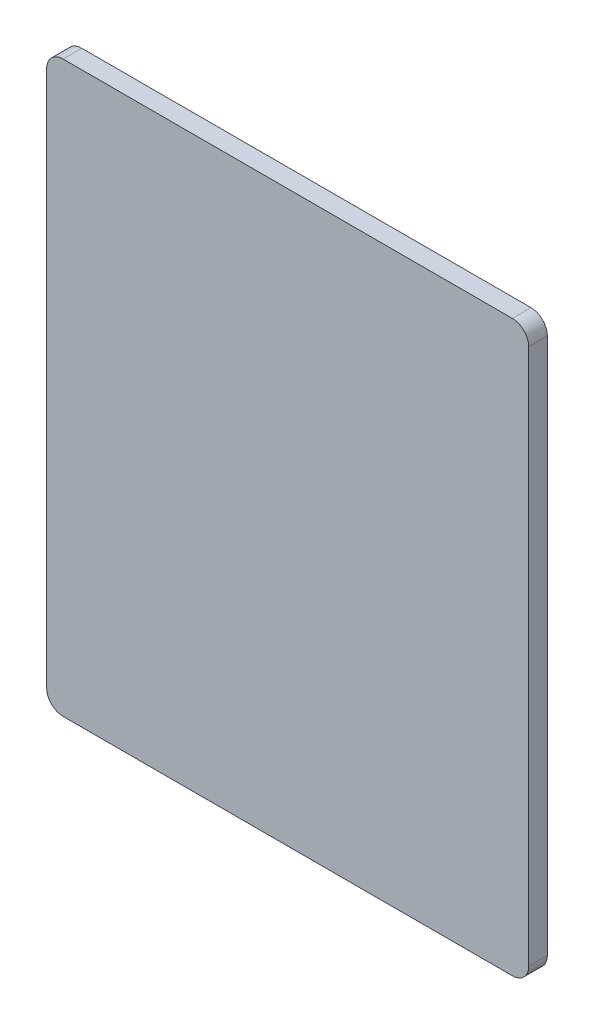
ISO-10303-21;
HEADER;
FILE_DESCRIPTION(('STEP AP214'),'2;1');
FILE_NAME('part.step','',(''),(''),'','','');
FILE_SCHEMA(('AUTOMOTIVE_DESIGN { 1 0 10303 214 1 1 1 1 }'));
ENDSEC;
DATA;
#1=APPLICATION_CONTEXT('core data for automotive mechanical design processes');
#2=APPLICATION_PROTOCOL_DEFINITION('international standard','automotive_design',2000,#1);
#3=PRODUCT_CONTEXT('',#1,'mechanical');
#4=PRODUCT('Part','Part','',(#3));
#5=PRODUCT_RELATED_PRODUCT_CATEGORY('part','',(#4));
#6=PRODUCT_DEFINITION_FORMATION('','',#4);
#7=PRODUCT_DEFINITION_CONTEXT('part definition',#1,'design');
#8=PRODUCT_DEFINITION('design','',#6,#7);
#9=PRODUCT_DEFINITION_SHAPE('','',#8);
#10=(LENGTH_UNIT() NAMED_UNIT(*) SI_UNIT(.MILLI.,.METRE.));
#11=(NAMED_UNIT(*) PLANE_ANGLE_UNIT() SI_UNIT($,.RADIAN.));
#12=(NAMED_UNIT(*) SI_UNIT($,.STERADIAN.) SOLID_ANGLE_UNIT());
#13=UNCERTAINTY_MEASURE_WITH_UNIT(LENGTH_MEASURE(1.E-05),#10,'distance_accuracy_value','');
#14=(GEOMETRIC_REPRESENTATION_CONTEXT(3) GLOBAL_UNCERTAINTY_ASSIGNED_CONTEXT((#13)) GLOBAL_UNIT_ASSIGNED_CONTEXT((#10,
#11,#12)) REPRESENTATION_CONTEXT('',''));
#15=CARTESIAN_POINT('',(0.,0.,0.));
#16=DIRECTION('',(0.,0.,1.));
#17=DIRECTION('',(1.,0.,0.));
#18=AXIS2_PLACEMENT_3D('',#15,#16,#17);
#19=CARTESIAN_POINT('',(265.,-313.,10.25));
#20=DIRECTION('',(-1.,0.,0.));
#21=DIRECTION('',(0.,0.,1.));
#22=AXIS2_PLACEMENT_3D('',#19,#20,#21);
#23=PLANE('',#22);
#24=DIRECTION('',(0.,1.,0.));
#25=VECTOR('',#24,1.);
#26=CARTESIAN_POINT('',(265.,-313.,10.25));
#27=LINE('',#26,#25);
#28=CARTESIAN_POINT('',(265.,-295.,10.25));
#29=VERTEX_POINT('',#28);
#30=CARTESIAN_POINT('',(265.,295.,10.25));
#31=VERTEX_POINT('',#30);
#32=EDGE_CURVE('E127',#29,#31,#27,.T.);
#33=ORIENTED_EDGE('',*,*,#32,.F.);
#34=DIRECTION('',(0.,0.,-1.));
#35=VECTOR('',#34,1.);
#36=CARTESIAN_POINT('',(265.,-295.,10.25));
#37=LINE('',#36,#35);
#38=CARTESIAN_POINT('',(265.,-295.,-10.25));
#39=VERTEX_POINT('',#38);
#40=EDGE_CURVE('E153',#29,#39,#37,.T.);
#41=ORIENTED_EDGE('',*,*,#40,.T.);
#42=DIRECTION('',(0.,1.,0.));
#43=VECTOR('',#42,1.);
#44=CARTESIAN_POINT('',(265.,-313.,-10.25));
#45=LINE('',#44,#43);
#46=CARTESIAN_POINT('',(265.,295.,-10.25));
#47=VERTEX_POINT('',#46);
#48=EDGE_CURVE('E159',#39,#47,#45,.T.);
#49=ORIENTED_EDGE('',*,*,#48,.T.);
#50=DIRECTION('',(0.,0.,-1.));
#51=VECTOR('',#50,1.);
#52=CARTESIAN_POINT('',(265.,295.,10.25));
#53=LINE('',#52,#51);
#54=EDGE_CURVE('E151',#47,#31,#53,.F.);
#55=ORIENTED_EDGE('',*,*,#54,.T.);
#56=EDGE_LOOP('',(#33,#41,#49,#55));
#57=FACE_BOUND('',#56,.T.);
#58=ADVANCED_FACE('F35',(#57),#23,.F.);
#59=CARTESIAN_POINT('',(-265.,313.,10.25));
#60=DIRECTION('',(0.,-1.,0.));
#61=DIRECTION('',(0.,0.,-1.));
#62=AXIS2_PLACEMENT_3D('',#59,#60,#61);
#63=PLANE('',#62);
#64=DIRECTION('',(-1.,0.,0.));
#65=VECTOR('',#64,1.);
#66=CARTESIAN_POINT('',(-265.,313.,10.25));
#67=LINE('',#66,#65);
#68=CARTESIAN_POINT('',(247.,313.,10.25));
#69=VERTEX_POINT('',#68);
#70=CARTESIAN_POINT('',(-247.,313.,10.25));
#71=VERTEX_POINT('',#70);
#72=EDGE_CURVE('E130',#69,#71,#67,.T.);
#73=ORIENTED_EDGE('',*,*,#72,.F.);
#74=DIRECTION('',(0.,0.,-1.));
#75=VECTOR('',#74,1.);
#76=CARTESIAN_POINT('',(247.,313.,10.25));
#77=LINE('',#76,#75);
#78=CARTESIAN_POINT('',(247.,313.,-10.25));
#79=VERTEX_POINT('',#78);
#80=EDGE_CURVE('E11',#69,#79,#77,.T.);
#81=ORIENTED_EDGE('',*,*,#80,.T.);
#82=DIRECTION('',(-1.,0.,0.));
#83=VECTOR('',#82,1.);
#84=CARTESIAN_POINT('',(-265.,313.,-10.25));
#85=LINE('',#84,#83);
#86=CARTESIAN_POINT('',(-247.,313.,-10.25));
#87=VERTEX_POINT('',#86);
#88=EDGE_CURVE('E132',#79,#87,#85,.T.);
#89=ORIENTED_EDGE('',*,*,#88,.T.);
#90=DIRECTION('',(0.,0.,-1.));
#91=VECTOR('',#90,1.);
#92=CARTESIAN_POINT('',(-247.,313.,10.25));
#93=LINE('',#92,#91);
#94=EDGE_CURVE('E43',#87,#71,#93,.F.);
#95=ORIENTED_EDGE('',*,*,#94,.T.);
#96=EDGE_LOOP('',(#73,#81,#89,#95));
#97=FACE_BOUND('',#96,.T.);
#98=ADVANCED_FACE('F178',(#97),#63,.F.);
#99=CARTESIAN_POINT('',(-265.,-313.,10.25));
#100=DIRECTION('',(1.,0.,0.));
#101=DIRECTION('',(0.,0.,-1.));
#102=AXIS2_PLACEMENT_3D('',#99,#100,#101);
#103=PLANE('',#102);
#104=DIRECTION('',(0.,-1.,0.));
#105=VECTOR('',#104,1.);
#106=CARTESIAN_POINT('',(-265.,-313.,-10.25));
#107=LINE('',#106,#105);
#108=CARTESIAN_POINT('',(-265.,295.,-10.25));
#109=VERTEX_POINT('',#108);
#110=CARTESIAN_POINT('',(-265.,-295.,-10.25));
#111=VERTEX_POINT('',#110);
#112=EDGE_CURVE('E128',#109,#111,#107,.T.);
#113=ORIENTED_EDGE('',*,*,#112,.T.);
#114=DIRECTION('',(0.,0.,-1.));
#115=VECTOR('',#114,1.);
#116=CARTESIAN_POINT('',(-265.,-295.,10.25));
#117=LINE('',#116,#115);
#118=CARTESIAN_POINT('',(-265.,-295.,10.25));
#119=VERTEX_POINT('',#118);
#120=EDGE_CURVE('E106',#111,#119,#117,.F.);
#121=ORIENTED_EDGE('',*,*,#120,.T.);
#122=DIRECTION('',(0.,-1.,0.));
#123=VECTOR('',#122,1.);
#124=CARTESIAN_POINT('',(-265.,-313.,10.25));
#125=LINE('',#124,#123);
#126=CARTESIAN_POINT('',(-265.,295.,10.25));
#127=VERTEX_POINT('',#126);
#128=EDGE_CURVE('E167',#127,#119,#125,.T.);
#129=ORIENTED_EDGE('',*,*,#128,.F.);
#130=DIRECTION('',(0.,0.,-1.));
#131=VECTOR('',#130,1.);
#132=CARTESIAN_POINT('',(-265.,295.,10.25));
#133=LINE('',#132,#131);
#134=EDGE_CURVE('E111',#127,#109,#133,.T.);
#135=ORIENTED_EDGE('',*,*,#134,.T.);
#136=EDGE_LOOP('',(#113,#121,#129,#135));
#137=FACE_BOUND('',#136,.T.);
#138=ADVANCED_FACE('F177',(#137),#103,.F.);
#139=CARTESIAN_POINT('',(-265.,-313.,10.25));
#140=DIRECTION('',(0.,1.,0.));
#141=DIRECTION('',(0.,0.,1.));
#142=AXIS2_PLACEMENT_3D('',#139,#140,#141);
#143=PLANE('',#142);
#144=DIRECTION('',(1.,0.,0.));
#145=VECTOR('',#144,1.);
#146=CARTESIAN_POINT('',(-265.,-313.,10.25));
#147=LINE('',#146,#145);
#148=CARTESIAN_POINT('',(-247.,-313.,10.25));
#149=VERTEX_POINT('',#148);
#150=CARTESIAN_POINT('',(247.,-313.,10.25));
#151=VERTEX_POINT('',#150);
#152=EDGE_CURVE('E121',#149,#151,#147,.T.);
#153=ORIENTED_EDGE('',*,*,#152,.F.);
#154=DIRECTION('',(0.,0.,-1.));
#155=VECTOR('',#154,1.);
#156=CARTESIAN_POINT('',(-247.,-313.,10.25));
#157=LINE('',#156,#155);
#158=CARTESIAN_POINT('',(-247.,-313.,-10.25));
#159=VERTEX_POINT('',#158);
#160=EDGE_CURVE('E105',#149,#159,#157,.T.);
#161=ORIENTED_EDGE('',*,*,#160,.T.);
#162=DIRECTION('',(1.,0.,0.));
#163=VECTOR('',#162,1.);
#164=CARTESIAN_POINT('',(-265.,-313.,-10.25));
#165=LINE('',#164,#163);
#166=CARTESIAN_POINT('',(247.,-313.,-10.25));
#167=VERTEX_POINT('',#166);
#168=EDGE_CURVE('E118',#159,#167,#165,.T.);
#169=ORIENTED_EDGE('',*,*,#168,.T.);
#170=DIRECTION('',(0.,0.,-1.));
#171=VECTOR('',#170,1.);
#172=CARTESIAN_POINT('',(247.,-313.,10.25));
#173=LINE('',#172,#171);
#174=EDGE_CURVE('E123',#167,#151,#173,.F.);
#175=ORIENTED_EDGE('',*,*,#174,.T.);
#176=EDGE_LOOP('',(#153,#161,#169,#175));
#177=FACE_BOUND('',#176,.T.);
#178=ADVANCED_FACE('F117',(#177),#143,.F.);
#179=CARTESIAN_POINT('',(0.,0.,10.25));
#180=DIRECTION('',(0.,0.,-1.));
#181=DIRECTION('',(-1.,0.,0.));
#182=AXIS2_PLACEMENT_3D('',#179,#180,#181);
#183=PLANE('',#182);
#184=ORIENTED_EDGE('',*,*,#128,.T.);
#185=CARTESIAN_POINT('',(-247.,-295.,10.25));
#186=DIRECTION('',(0.,0.,-1.));
#187=DIRECTION('',(-1.,0.,0.));
#188=AXIS2_PLACEMENT_3D('',#185,#186,#187);
#189=CIRCLE('',#188,18.);
#190=EDGE_CURVE('E149',#119,#149,#189,.F.);
#191=ORIENTED_EDGE('',*,*,#190,.T.);
#192=ORIENTED_EDGE('',*,*,#152,.T.);
#193=CARTESIAN_POINT('',(247.,-295.,10.25));
#194=DIRECTION('',(0.,0.,-1.));
#195=DIRECTION('',(-1.,0.,0.));
#196=AXIS2_PLACEMENT_3D('',#193,#194,#195);
#197=CIRCLE('',#196,18.);
#198=EDGE_CURVE('E147',#151,#29,#197,.F.);
#199=ORIENTED_EDGE('',*,*,#198,.T.);
#200=ORIENTED_EDGE('',*,*,#32,.T.);
#201=CARTESIAN_POINT('',(247.,295.,10.25));
#202=DIRECTION('',(0.,0.,-1.));
#203=DIRECTION('',(-1.,0.,0.));
#204=AXIS2_PLACEMENT_3D('',#201,#202,#203);
#205=CIRCLE('',#204,18.);
#206=EDGE_CURVE('E56',#31,#69,#205,.F.);
#207=ORIENTED_EDGE('',*,*,#206,.T.);
#208=ORIENTED_EDGE('',*,*,#72,.T.);
#209=CARTESIAN_POINT('',(-247.,295.,10.25));
#210=DIRECTION('',(0.,0.,-1.));
#211=DIRECTION('',(-1.,0.,0.));
#212=AXIS2_PLACEMENT_3D('',#209,#210,#211);
#213=CIRCLE('',#212,18.);
#214=EDGE_CURVE('E144',#71,#127,#213,.F.);
#215=ORIENTED_EDGE('',*,*,#214,.T.);
#216=EDGE_LOOP('',(#184,#191,#192,#199,#200,#207,#208,#215));
#217=FACE_BOUND('',#216,.T.);
#218=ADVANCED_FACE('F171',(#217),#183,.F.);
#219=CARTESIAN_POINT('',(0.,0.,-10.25));
#220=DIRECTION('',(0.,0.,-1.));
#221=DIRECTION('',(-1.,0.,0.));
#222=AXIS2_PLACEMENT_3D('',#219,#220,#221);
#223=PLANE('',#222);
#224=ORIENTED_EDGE('',*,*,#168,.F.);
#225=CARTESIAN_POINT('',(-247.,-295.,-10.25));
#226=DIRECTION('',(0.,0.,-1.));
#227=DIRECTION('',(-1.,0.,0.));
#228=AXIS2_PLACEMENT_3D('',#225,#226,#227);
#229=CIRCLE('',#228,18.);
#230=EDGE_CURVE('E101',#159,#111,#229,.T.);
#231=ORIENTED_EDGE('',*,*,#230,.T.);
#232=ORIENTED_EDGE('',*,*,#112,.F.);
#233=CARTESIAN_POINT('',(-247.,295.,-10.25));
#234=DIRECTION('',(0.,0.,-1.));
#235=DIRECTION('',(-1.,0.,0.));
#236=AXIS2_PLACEMENT_3D('',#233,#234,#235);
#237=CIRCLE('',#236,18.);
#238=EDGE_CURVE('E122',#109,#87,#237,.T.);
#239=ORIENTED_EDGE('',*,*,#238,.T.);
#240=ORIENTED_EDGE('',*,*,#88,.F.);
#241=CARTESIAN_POINT('',(247.,295.,-10.25));
#242=DIRECTION('',(0.,0.,-1.));
#243=DIRECTION('',(-1.,0.,0.));
#244=AXIS2_PLACEMENT_3D('',#241,#242,#243);
#245=CIRCLE('',#244,18.);
#246=EDGE_CURVE('E138',#79,#47,#245,.T.);
#247=ORIENTED_EDGE('',*,*,#246,.T.);
#248=ORIENTED_EDGE('',*,*,#48,.F.);
#249=CARTESIAN_POINT('',(247.,-295.,-10.25));
#250=DIRECTION('',(0.,0.,-1.));
#251=DIRECTION('',(-1.,0.,0.));
#252=AXIS2_PLACEMENT_3D('',#249,#250,#251);
#253=CIRCLE('',#252,18.);
#254=EDGE_CURVE('E112',#39,#167,#253,.T.);
#255=ORIENTED_EDGE('',*,*,#254,.T.);
#256=EDGE_LOOP('',(#224,#231,#232,#239,#240,#247,#248,#255));
#257=FACE_BOUND('',#256,.T.);
#258=ADVANCED_FACE('F125',(#257),#223,.T.);
#259=CARTESIAN_POINT('',(-247.,-295.,10.25));
#260=DIRECTION('',(0.,0.,-1.));
#261=DIRECTION('',(-1.,0.,0.));
#262=AXIS2_PLACEMENT_3D('',#259,#260,#261);
#263=CYLINDRICAL_SURFACE('',#262,18.);
#264=ORIENTED_EDGE('',*,*,#190,.F.);
#265=ORIENTED_EDGE('',*,*,#120,.F.);
#266=ORIENTED_EDGE('',*,*,#230,.F.);
#267=ORIENTED_EDGE('',*,*,#160,.F.);
#268=EDGE_LOOP('',(#264,#265,#266,#267));
#269=FACE_BOUND('',#268,.T.);
#270=ADVANCED_FACE('F104',(#269),#263,.T.);
#271=CARTESIAN_POINT('',(247.,-295.,10.25));
#272=DIRECTION('',(0.,0.,-1.));
#273=DIRECTION('',(-1.,0.,0.));
#274=AXIS2_PLACEMENT_3D('',#271,#272,#273);
#275=CYLINDRICAL_SURFACE('',#274,18.);
#276=ORIENTED_EDGE('',*,*,#198,.F.);
#277=ORIENTED_EDGE('',*,*,#174,.F.);
#278=ORIENTED_EDGE('',*,*,#254,.F.);
#279=ORIENTED_EDGE('',*,*,#40,.F.);
#280=EDGE_LOOP('',(#276,#277,#278,#279));
#281=FACE_BOUND('',#280,.T.);
#282=ADVANCED_FACE('F181',(#281),#275,.T.);
#283=CARTESIAN_POINT('',(247.,295.,10.25));
#284=DIRECTION('',(0.,0.,-1.));
#285=DIRECTION('',(-1.,0.,0.));
#286=AXIS2_PLACEMENT_3D('',#283,#284,#285);
#287=CYLINDRICAL_SURFACE('',#286,18.);
#288=ORIENTED_EDGE('',*,*,#206,.F.);
#289=ORIENTED_EDGE('',*,*,#54,.F.);
#290=ORIENTED_EDGE('',*,*,#246,.F.);
#291=ORIENTED_EDGE('',*,*,#80,.F.);
#292=EDGE_LOOP('',(#288,#289,#290,#291));
#293=FACE_BOUND('',#292,.T.);
#294=ADVANCED_FACE('F180',(#293),#287,.T.);
#295=CARTESIAN_POINT('',(-247.,295.,10.25));
#296=DIRECTION('',(0.,0.,-1.));
#297=DIRECTION('',(-1.,0.,0.));
#298=AXIS2_PLACEMENT_3D('',#295,#296,#297);
#299=CYLINDRICAL_SURFACE('',#298,18.);
#300=ORIENTED_EDGE('',*,*,#214,.F.);
#301=ORIENTED_EDGE('',*,*,#94,.F.);
#302=ORIENTED_EDGE('',*,*,#238,.F.);
#303=ORIENTED_EDGE('',*,*,#134,.F.);
#304=EDGE_LOOP('',(#300,#301,#302,#303));
#305=FACE_BOUND('',#304,.T.);
#306=ADVANCED_FACE('F37',(#305),#299,.T.);
#307=CLOSED_SHELL('',(#58,#98,#138,#178,#218,#258,#270,#282,#294,#306));
#308=MANIFOLD_SOLID_BREP('B2',#307);
#309=ADVANCED_BREP_SHAPE_REPRESENTATION('',(#18,#308),#14);
#310=SHAPE_DEFINITION_REPRESENTATION(#9,#309);
ENDSEC;
END-ISO-10303-21;
